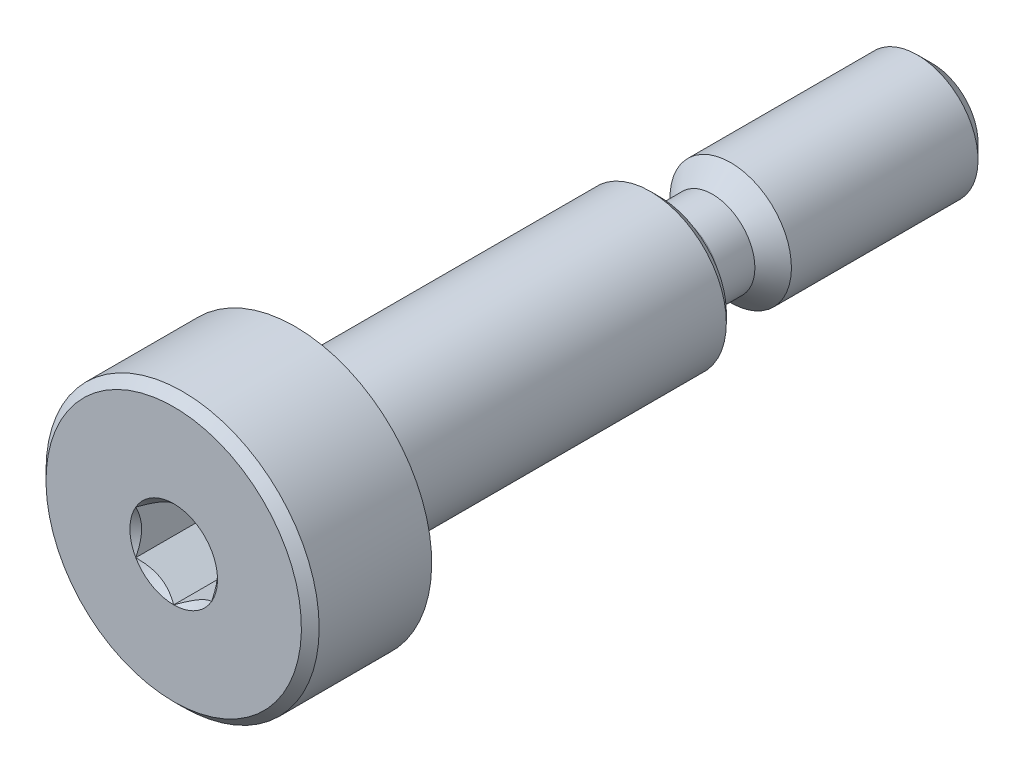
ISO-10303-21;
HEADER;
FILE_DESCRIPTION(('STEP AP214'),'2;1');
FILE_NAME('part.step','',(''),(''),'','','');
FILE_SCHEMA(('AUTOMOTIVE_DESIGN { 1 0 10303 214 1 1 1 1 }'));
ENDSEC;
DATA;
#1=APPLICATION_CONTEXT('core data for automotive mechanical design processes');
#2=APPLICATION_PROTOCOL_DEFINITION('international standard','automotive_design',2000,#1);
#3=PRODUCT_CONTEXT('',#1,'mechanical');
#4=PRODUCT('Part','Part','',(#3));
#5=PRODUCT_RELATED_PRODUCT_CATEGORY('part','',(#4));
#6=PRODUCT_DEFINITION_FORMATION('','',#4);
#7=PRODUCT_DEFINITION_CONTEXT('part definition',#1,'design');
#8=PRODUCT_DEFINITION('design','',#6,#7);
#9=PRODUCT_DEFINITION_SHAPE('','',#8);
#10=(LENGTH_UNIT() NAMED_UNIT(*) SI_UNIT(.MILLI.,.METRE.));
#11=(NAMED_UNIT(*) PLANE_ANGLE_UNIT() SI_UNIT($,.RADIAN.));
#12=(NAMED_UNIT(*) SI_UNIT($,.STERADIAN.) SOLID_ANGLE_UNIT());
#13=UNCERTAINTY_MEASURE_WITH_UNIT(LENGTH_MEASURE(1.E-05),#10,'distance_accuracy_value','');
#14=(GEOMETRIC_REPRESENTATION_CONTEXT(3) GLOBAL_UNCERTAINTY_ASSIGNED_CONTEXT((#13)) GLOBAL_UNIT_ASSIGNED_CONTEXT((#10,
#11,#12)) REPRESENTATION_CONTEXT('',''));
#15=CARTESIAN_POINT('',(0.,0.,0.));
#16=DIRECTION('',(0.,0.,1.));
#17=DIRECTION('',(1.,0.,0.));
#18=AXIS2_PLACEMENT_3D('',#15,#16,#17);
#19=CARTESIAN_POINT('',(0.,0.,-25.));
#20=DIRECTION('',(0.,0.,-1.));
#21=DIRECTION('',(0.,1.,0.));
#22=AXIS2_PLACEMENT_3D('',#19,#20,#21);
#23=CYLINDRICAL_SURFACE('',#22,2.5);
#24=CARTESIAN_POINT('',(0.,0.,-15.7075));
#25=DIRECTION('',(0.,0.,-1.));
#26=DIRECTION('',(0.,1.,0.));
#27=AXIS2_PLACEMENT_3D('',#24,#25,#26);
#28=CIRCLE('',#27,2.5);
#29=CARTESIAN_POINT('',(0.,-2.5,-15.7075));
#30=VERTEX_POINT('',#29);
#31=EDGE_CURVE('E256',#30,#30,#28,.F.);
#32=ORIENTED_EDGE('',*,*,#31,.T.);
#33=EDGE_LOOP('',(#32));
#34=FACE_BOUND('',#33,.T.);
#35=CARTESIAN_POINT('',(0.,0.,-4.7625));
#36=DIRECTION('',(0.,0.,-1.));
#37=DIRECTION('',(0.,1.,0.));
#38=AXIS2_PLACEMENT_3D('',#35,#36,#37);
#39=CIRCLE('',#38,2.5);
#40=CARTESIAN_POINT('',(0.,2.5,-4.7625));
#41=VERTEX_POINT('',#40);
#42=EDGE_CURVE('E284',#41,#41,#39,.T.);
#43=ORIENTED_EDGE('',*,*,#42,.T.);
#44=EDGE_LOOP('',(#43));
#45=FACE_BOUND('',#44,.T.);
#46=ADVANCED_FACE('F40',(#34,#45),#23,.T.);
#47=CARTESIAN_POINT('',(0.,-2.5,-16.));
#48=DIRECTION('',(0.,0.,-1.));
#49=DIRECTION('',(0.,1.,0.));
#50=AXIS2_PLACEMENT_3D('',#47,#48,#49);
#51=PLANE('',#50);
#52=CARTESIAN_POINT('',(0.,0.,-16.));
#53=DIRECTION('',(0.,0.,-1.));
#54=DIRECTION('',(0.,1.,0.));
#55=AXIS2_PLACEMENT_3D('',#52,#53,#54);
#56=CIRCLE('',#55,2.20749999999999);
#57=CARTESIAN_POINT('',(0.,-2.2075,-16.));
#58=VERTEX_POINT('',#57);
#59=EDGE_CURVE('E259',#58,#58,#56,.T.);
#60=ORIENTED_EDGE('',*,*,#59,.T.);
#61=EDGE_LOOP('',(#60));
#62=FACE_BOUND('',#61,.T.);
#63=CARTESIAN_POINT('',(0.,0.,-16.));
#64=DIRECTION('',(0.,0.,-1.));
#65=DIRECTION('',(0.,1.,0.));
#66=AXIS2_PLACEMENT_3D('',#63,#64,#65);
#67=CIRCLE('',#66,2.00000000000001);
#68=CARTESIAN_POINT('',(0.,2.00000000000001,-16.));
#69=VERTEX_POINT('',#68);
#70=EDGE_CURVE('E310',#69,#69,#67,.T.);
#71=ORIENTED_EDGE('',*,*,#70,.F.);
#72=EDGE_LOOP('',(#71));
#73=FACE_BOUND('',#72,.T.);
#74=ADVANCED_FACE('F210',(#62,#73),#51,.T.);
#75=CARTESIAN_POINT('',(0.,0.,-25.));
#76=DIRECTION('',(0.,0.,-1.));
#77=DIRECTION('',(0.,1.,0.));
#78=AXIS2_PLACEMENT_3D('',#75,#76,#77);
#79=CYLINDRICAL_SURFACE('',#78,1.9);
#80=CARTESIAN_POINT('',(0.,0.,-4.4375));
#81=DIRECTION('',(0.,0.,-1.));
#82=DIRECTION('',(0.,1.,0.));
#83=AXIS2_PLACEMENT_3D('',#80,#81,#82);
#84=CIRCLE('',#83,1.9);
#85=CARTESIAN_POINT('',(0.,1.9,-4.4375));
#86=VERTEX_POINT('',#85);
#87=EDGE_CURVE('E304',#86,#86,#84,.F.);
#88=ORIENTED_EDGE('',*,*,#87,.T.);
#89=EDGE_LOOP('',(#88));
#90=FACE_BOUND('',#89,.T.);
#91=CARTESIAN_POINT('',(0.,0.,-4.));
#92=DIRECTION('',(0.,0.,-1.));
#93=DIRECTION('',(0.,1.,0.));
#94=AXIS2_PLACEMENT_3D('',#91,#92,#93);
#95=CIRCLE('',#94,1.9);
#96=CARTESIAN_POINT('',(0.,1.9,-4.));
#97=VERTEX_POINT('',#96);
#98=EDGE_CURVE('E285',#97,#97,#95,.T.);
#99=ORIENTED_EDGE('',*,*,#98,.T.);
#100=EDGE_LOOP('',(#99));
#101=FACE_BOUND('',#100,.T.);
#102=ADVANCED_FACE('F216',(#90,#101),#79,.T.);
#103=CARTESIAN_POINT('',(0.,2.5,-4.6));
#104=DIRECTION('',(0.,0.,-1.));
#105=DIRECTION('',(0.,1.,0.));
#106=AXIS2_PLACEMENT_3D('',#103,#104,#105);
#107=PLANE('',#106);
#108=CARTESIAN_POINT('',(0.,0.,-4.6));
#109=DIRECTION('',(0.,0.,-1.));
#110=DIRECTION('',(0.,1.,0.));
#111=AXIS2_PLACEMENT_3D('',#108,#109,#110);
#112=CIRCLE('',#111,2.33749999999999);
#113=CARTESIAN_POINT('',(0.,2.33749999999999,-4.6));
#114=VERTEX_POINT('',#113);
#115=EDGE_CURVE('E300',#114,#114,#112,.F.);
#116=ORIENTED_EDGE('',*,*,#115,.T.);
#117=EDGE_LOOP('',(#116));
#118=FACE_BOUND('',#117,.T.);
#119=CARTESIAN_POINT('',(0.,0.,-4.6));
#120=DIRECTION('',(0.,0.,-1.));
#121=DIRECTION('',(0.,1.,0.));
#122=AXIS2_PLACEMENT_3D('',#119,#120,#121);
#123=CIRCLE('',#122,2.06249999999999);
#124=CARTESIAN_POINT('',(0.,2.06249999999999,-4.6));
#125=VERTEX_POINT('',#124);
#126=EDGE_CURVE('E290',#125,#125,#123,.T.);
#127=ORIENTED_EDGE('',*,*,#126,.T.);
#128=EDGE_LOOP('',(#127));
#129=FACE_BOUND('',#128,.T.);
#130=ADVANCED_FACE('F234',(#118,#129),#107,.F.);
#131=CARTESIAN_POINT('',(0.,0.,0.));
#132=DIRECTION('',(0.,0.,1.));
#133=DIRECTION('',(0.,-1.,0.));
#134=AXIS2_PLACEMENT_3D('',#131,#132,#133);
#135=PLANE('',#134);
#136=CARTESIAN_POINT('',(0.,0.,0.));
#137=DIRECTION('',(0.,0.,1.));
#138=DIRECTION('',(1.,0.,0.));
#139=AXIS2_PLACEMENT_3D('',#136,#137,#138);
#140=CIRCLE('',#139,1.44337567297406);
#141=CARTESIAN_POINT('',(0.,-1.44337567297406,0.));
#142=VERTEX_POINT('',#141);
#143=CARTESIAN_POINT('',(1.25,-0.721687836487032,0.));
#144=VERTEX_POINT('',#143);
#145=EDGE_CURVE('E61',#142,#144,#140,.T.);
#146=ORIENTED_EDGE('',*,*,#145,.F.);
#147=CARTESIAN_POINT('',(-1.25,-0.721687836487031,0.));
#148=VERTEX_POINT('',#147);
#149=EDGE_CURVE('E68',#148,#142,#140,.T.);
#150=ORIENTED_EDGE('',*,*,#149,.F.);
#151=CARTESIAN_POINT('',(-1.25,0.721687836487033,0.));
#152=VERTEX_POINT('',#151);
#153=EDGE_CURVE('E148',#152,#148,#140,.T.);
#154=ORIENTED_EDGE('',*,*,#153,.F.);
#155=CARTESIAN_POINT('',(0.,1.44337567297406,0.));
#156=VERTEX_POINT('',#155);
#157=EDGE_CURVE('E140',#156,#152,#140,.T.);
#158=ORIENTED_EDGE('',*,*,#157,.F.);
#159=CARTESIAN_POINT('',(1.25,0.721687836487033,0.));
#160=VERTEX_POINT('',#159);
#161=EDGE_CURVE('E110',#160,#156,#140,.T.);
#162=ORIENTED_EDGE('',*,*,#161,.F.);
#163=EDGE_CURVE('E100',#144,#160,#140,.T.);
#164=ORIENTED_EDGE('',*,*,#163,.F.);
#165=EDGE_LOOP('',(#146,#150,#154,#158,#162,#164));
#166=FACE_BOUND('',#165,.T.);
#167=CARTESIAN_POINT('',(0.,0.,0.));
#168=DIRECTION('',(0.,0.,1.));
#169=DIRECTION('',(0.,-1.,0.));
#170=AXIS2_PLACEMENT_3D('',#167,#168,#169);
#171=CIRCLE('',#170,4.2075);
#172=CARTESIAN_POINT('',(0.,-4.2075,0.));
#173=VERTEX_POINT('',#172);
#174=EDGE_CURVE('E55',#173,#173,#171,.T.);
#175=ORIENTED_EDGE('',*,*,#174,.T.);
#176=EDGE_LOOP('',(#175));
#177=FACE_BOUND('',#176,.T.);
#178=ADVANCED_FACE('F137',(#166,#177),#135,.T.);
#179=CARTESIAN_POINT('',(0.,0.,-25.));
#180=DIRECTION('',(0.,0.,-1.));
#181=DIRECTION('',(0.,1.,0.));
#182=AXIS2_PLACEMENT_3D('',#179,#180,#181);
#183=CYLINDRICAL_SURFACE('',#182,4.49999999999999);
#184=CARTESIAN_POINT('',(0.,0.,-0.292499999999994));
#185=DIRECTION('',(0.,0.,1.));
#186=DIRECTION('',(0.,-1.,0.));
#187=AXIS2_PLACEMENT_3D('',#184,#185,#186);
#188=CIRCLE('',#187,4.49999999999999);
#189=CARTESIAN_POINT('',(0.,-4.49999999999999,-0.292499999999993));
#190=VERTEX_POINT('',#189);
#191=EDGE_CURVE('E265',#190,#190,#188,.F.);
#192=ORIENTED_EDGE('',*,*,#191,.T.);
#193=EDGE_LOOP('',(#192));
#194=FACE_BOUND('',#193,.T.);
#195=CARTESIAN_POINT('',(0.,0.,-4.));
#196=DIRECTION('',(0.,0.,-1.));
#197=DIRECTION('',(0.,1.,0.));
#198=AXIS2_PLACEMENT_3D('',#195,#196,#197);
#199=CIRCLE('',#198,4.49999999999999);
#200=CARTESIAN_POINT('',(0.,4.49999999999999,-4.));
#201=VERTEX_POINT('',#200);
#202=EDGE_CURVE('E282',#201,#201,#199,.T.);
#203=ORIENTED_EDGE('',*,*,#202,.F.);
#204=EDGE_LOOP('',(#203));
#205=FACE_BOUND('',#204,.T.);
#206=ADVANCED_FACE('F227',(#194,#205),#183,.T.);
#207=CARTESIAN_POINT('',(0.,-4.49999999999999,-4.));
#208=DIRECTION('',(0.,0.,-1.));
#209=DIRECTION('',(0.,1.,0.));
#210=AXIS2_PLACEMENT_3D('',#207,#208,#209);
#211=PLANE('',#210);
#212=ORIENTED_EDGE('',*,*,#202,.T.);
#213=EDGE_LOOP('',(#212));
#214=FACE_BOUND('',#213,.T.);
#215=ORIENTED_EDGE('',*,*,#98,.F.);
#216=EDGE_LOOP('',(#215));
#217=FACE_BOUND('',#216,.T.);
#218=ADVANCED_FACE('F223',(#214,#217),#211,.T.);
#219=CARTESIAN_POINT('',(0.,0.,-4.7625));
#220=DIRECTION('',(0.,0.,-1.));
#221=DIRECTION('',(0.,1.,0.));
#222=AXIS2_PLACEMENT_3D('',#219,#220,#221);
#223=CONICAL_SURFACE('',#222,2.5,0.785398163397452);
#224=ORIENTED_EDGE('',*,*,#115,.F.);
#225=EDGE_LOOP('',(#224));
#226=FACE_BOUND('',#225,.T.);
#227=ORIENTED_EDGE('',*,*,#42,.F.);
#228=EDGE_LOOP('',(#227));
#229=FACE_BOUND('',#228,.T.);
#230=ADVANCED_FACE('F226',(#226,#229),#223,.T.);
#231=CARTESIAN_POINT('',(0.,0.,-4.6));
#232=DIRECTION('',(0.,0.,-1.));
#233=DIRECTION('',(0.,1.,0.));
#234=AXIS2_PLACEMENT_3D('',#231,#232,#233);
#235=CONICAL_SURFACE('',#234,2.06249999999999,0.785398163397456);
#236=ORIENTED_EDGE('',*,*,#87,.F.);
#237=EDGE_LOOP('',(#236));
#238=FACE_BOUND('',#237,.T.);
#239=ORIENTED_EDGE('',*,*,#126,.F.);
#240=EDGE_LOOP('',(#239));
#241=FACE_BOUND('',#240,.T.);
#242=ADVANCED_FACE('F237',(#238,#241),#235,.T.);
#243=CARTESIAN_POINT('',(0.,0.,-16.602));
#244=DIRECTION('',(0.,0.,-1.));
#245=DIRECTION('',(0.,1.,0.));
#246=AXIS2_PLACEMENT_3D('',#243,#244,#245);
#247=TOROIDAL_SURFACE('',#246,2.00000000000001,0.602000000000016);
#248=CARTESIAN_POINT('',(0.,0.,-16.602));
#249=DIRECTION('',(0.,0.,-1.));
#250=DIRECTION('',(0.,1.,0.));
#251=AXIS2_PLACEMENT_3D('',#248,#249,#250);
#252=CIRCLE('',#251,1.398);
#253=CARTESIAN_POINT('',(0.,1.39799999999999,-16.602));
#254=VERTEX_POINT('',#253);
#255=EDGE_CURVE('E388',#254,#254,#252,.T.);
#256=ORIENTED_EDGE('',*,*,#255,.F.);
#257=EDGE_LOOP('',(#256));
#258=FACE_BOUND('',#257,.T.);
#259=ORIENTED_EDGE('',*,*,#70,.T.);
#260=EDGE_LOOP('',(#259));
#261=FACE_BOUND('',#260,.T.);
#262=ADVANCED_FACE('F241',(#258,#261),#247,.F.);
#263=CARTESIAN_POINT('',(0.,0.,-25.));
#264=DIRECTION('',(0.,0.,-1.));
#265=DIRECTION('',(0.,1.,0.));
#266=AXIS2_PLACEMENT_3D('',#263,#264,#265);
#267=CYLINDRICAL_SURFACE('',#266,1.398);
#268=CARTESIAN_POINT('',(0.,0.,-17.75));
#269=DIRECTION('',(0.,0.,-1.));
#270=DIRECTION('',(0.,1.,0.));
#271=AXIS2_PLACEMENT_3D('',#268,#269,#270);
#272=CIRCLE('',#271,1.398);
#273=CARTESIAN_POINT('',(0.,1.39799999999999,-17.75));
#274=VERTEX_POINT('',#273);
#275=EDGE_CURVE('E372',#274,#274,#272,.T.);
#276=ORIENTED_EDGE('',*,*,#275,.F.);
#277=EDGE_LOOP('',(#276));
#278=FACE_BOUND('',#277,.T.);
#279=ORIENTED_EDGE('',*,*,#255,.T.);
#280=EDGE_LOOP('',(#279));
#281=FACE_BOUND('',#280,.T.);
#282=ADVANCED_FACE('F325',(#278,#281),#267,.T.);
#283=CARTESIAN_POINT('',(0.,0.,-17.75));
#284=DIRECTION('',(0.,0.,-1.));
#285=DIRECTION('',(0.,1.,0.));
#286=AXIS2_PLACEMENT_3D('',#283,#284,#285);
#287=CONICAL_SURFACE('',#286,1.398,0.785398163397446);
#288=CARTESIAN_POINT('',(0.,0.,-18.352));
#289=DIRECTION('',(0.,0.,-1.));
#290=DIRECTION('',(0.,1.,0.));
#291=AXIS2_PLACEMENT_3D('',#288,#289,#290);
#292=CIRCLE('',#291,2.00000000000001);
#293=CARTESIAN_POINT('',(0.,2.00000000000001,-18.352));
#294=VERTEX_POINT('',#293);
#295=EDGE_CURVE('E293',#294,#294,#292,.F.);
#296=ORIENTED_EDGE('',*,*,#295,.T.);
#297=EDGE_LOOP('',(#296));
#298=FACE_BOUND('',#297,.T.);
#299=ORIENTED_EDGE('',*,*,#275,.T.);
#300=EDGE_LOOP('',(#299));
#301=FACE_BOUND('',#300,.T.);
#302=ADVANCED_FACE('F318',(#298,#301),#287,.T.);
#303=CARTESIAN_POINT('',(0.,-2.00000000000002,-25.));
#304=DIRECTION('',(0.,0.,-1.));
#305=DIRECTION('',(0.,1.,0.));
#306=AXIS2_PLACEMENT_3D('',#303,#304,#305);
#307=PLANE('',#306);
#308=CARTESIAN_POINT('',(0.,0.,-25.));
#309=DIRECTION('',(0.,0.,-1.));
#310=DIRECTION('',(0.,1.,0.));
#311=AXIS2_PLACEMENT_3D('',#308,#309,#310);
#312=CIRCLE('',#311,1.50000000000002);
#313=CARTESIAN_POINT('',(0.,1.50000000000001,-25.));
#314=VERTEX_POINT('',#313);
#315=EDGE_CURVE('E268',#314,#314,#312,.T.);
#316=ORIENTED_EDGE('',*,*,#315,.T.);
#317=EDGE_LOOP('',(#316));
#318=FACE_BOUND('',#317,.T.);
#319=ADVANCED_FACE('F315',(#318),#307,.T.);
#320=CARTESIAN_POINT('',(0.,0.,-25.));
#321=DIRECTION('',(0.,0.,-1.));
#322=DIRECTION('',(0.,1.,0.));
#323=AXIS2_PLACEMENT_3D('',#320,#321,#322);
#324=CYLINDRICAL_SURFACE('',#323,2.00000000000001);
#325=CARTESIAN_POINT('',(0.,0.,-24.5));
#326=DIRECTION('',(0.,0.,-1.));
#327=DIRECTION('',(0.,1.,0.));
#328=AXIS2_PLACEMENT_3D('',#325,#326,#327);
#329=CIRCLE('',#328,2.00000000000001);
#330=CARTESIAN_POINT('',(0.,2.00000000000001,-24.5));
#331=VERTEX_POINT('',#330);
#332=EDGE_CURVE('E261',#331,#331,#329,.F.);
#333=ORIENTED_EDGE('',*,*,#332,.T.);
#334=EDGE_LOOP('',(#333));
#335=FACE_BOUND('',#334,.T.);
#336=ORIENTED_EDGE('',*,*,#295,.F.);
#337=EDGE_LOOP('',(#336));
#338=FACE_BOUND('',#337,.T.);
#339=ADVANCED_FACE('F246',(#335,#338),#324,.T.);
#340=CARTESIAN_POINT('',(0.,0.,-25.));
#341=DIRECTION('',(0.,0.,1.));
#342=DIRECTION('',(0.,-1.,0.));
#343=AXIS2_PLACEMENT_3D('',#340,#341,#342);
#344=CONICAL_SURFACE('',#343,1.50000000000002,0.785398163397447);
#345=ORIENTED_EDGE('',*,*,#332,.F.);
#346=EDGE_LOOP('',(#345));
#347=FACE_BOUND('',#346,.T.);
#348=ORIENTED_EDGE('',*,*,#315,.F.);
#349=EDGE_LOOP('',(#348));
#350=FACE_BOUND('',#349,.T.);
#351=ADVANCED_FACE('F243',(#347,#350),#344,.T.);
#352=CARTESIAN_POINT('',(0.,0.,-16.));
#353=DIRECTION('',(0.,0.,1.));
#354=DIRECTION('',(0.,-1.,0.));
#355=AXIS2_PLACEMENT_3D('',#352,#353,#354);
#356=CONICAL_SURFACE('',#355,2.20749999999999,0.785398163397445);
#357=CARTESIAN_POINT('',(0.,-2.5,-15.7075));
#358=CARTESIAN_POINT('',(0.,-2.496953125,-15.710546875));
#359=CARTESIAN_POINT('',(0.,-2.49390625,-15.71359375));
#360=CARTESIAN_POINT('',(0.,-2.4878125,-15.7196875));
#361=CARTESIAN_POINT('',(0.,-2.484765625,-15.722734375));
#362=CARTESIAN_POINT('',(0.,-2.478671875,-15.728828125));
#363=CARTESIAN_POINT('',(0.,-2.475625,-15.731875));
#364=CARTESIAN_POINT('',(0.,-2.46953125,-15.73796875));
#365=CARTESIAN_POINT('',(0.,-2.466484375,-15.741015625));
#366=CARTESIAN_POINT('',(0.,-2.460390625,-15.747109375));
#367=CARTESIAN_POINT('',(0.,-2.45734375,-15.75015625));
#368=CARTESIAN_POINT('',(0.,-2.45125,-15.75625));
#369=CARTESIAN_POINT('',(0.,-2.448203125,-15.759296875));
#370=CARTESIAN_POINT('',(0.,-2.442109375,-15.765390625));
#371=CARTESIAN_POINT('',(0.,-2.4390625,-15.7684375));
#372=CARTESIAN_POINT('',(0.,-2.43296875,-15.77453125));
#373=CARTESIAN_POINT('',(0.,-2.429921875,-15.777578125));
#374=CARTESIAN_POINT('',(0.,-2.423828125,-15.783671875));
#375=CARTESIAN_POINT('',(0.,-2.42078125,-15.78671875));
#376=CARTESIAN_POINT('',(0.,-2.4146875,-15.7928125));
#377=CARTESIAN_POINT('',(0.,-2.411640625,-15.795859375));
#378=CARTESIAN_POINT('',(0.,-2.405546875,-15.801953125));
#379=CARTESIAN_POINT('',(0.,-2.4025,-15.805));
#380=CARTESIAN_POINT('',(0.,-2.39640625,-15.81109375));
#381=CARTESIAN_POINT('',(0.,-2.393359375,-15.814140625));
#382=CARTESIAN_POINT('',(0.,-2.387265625,-15.820234375));
#383=CARTESIAN_POINT('',(0.,-2.38421875,-15.82328125));
#384=CARTESIAN_POINT('',(0.,-2.378125,-15.829375));
#385=CARTESIAN_POINT('',(0.,-2.375078125,-15.832421875));
#386=CARTESIAN_POINT('',(0.,-2.368984375,-15.838515625));
#387=CARTESIAN_POINT('',(0.,-2.3659375,-15.8415625));
#388=CARTESIAN_POINT('',(0.,-2.35984375,-15.84765625));
#389=CARTESIAN_POINT('',(0.,-2.356796875,-15.850703125));
#390=CARTESIAN_POINT('',(0.,-2.350703125,-15.856796875));
#391=CARTESIAN_POINT('',(0.,-2.34765625,-15.85984375));
#392=CARTESIAN_POINT('',(0.,-2.3415625,-15.8659375));
#393=CARTESIAN_POINT('',(0.,-2.338515625,-15.868984375));
#394=CARTESIAN_POINT('',(0.,-2.332421875,-15.875078125));
#395=CARTESIAN_POINT('',(0.,-2.329375,-15.878125));
#396=CARTESIAN_POINT('',(0.,-2.32328125,-15.88421875));
#397=CARTESIAN_POINT('',(0.,-2.320234375,-15.887265625));
#398=CARTESIAN_POINT('',(0.,-2.314140625,-15.893359375));
#399=CARTESIAN_POINT('',(0.,-2.31109375,-15.89640625));
#400=CARTESIAN_POINT('',(0.,-2.305,-15.9025));
#401=CARTESIAN_POINT('',(0.,-2.301953125,-15.905546875));
#402=CARTESIAN_POINT('',(0.,-2.295859375,-15.911640625));
#403=CARTESIAN_POINT('',(0.,-2.2928125,-15.9146875));
#404=CARTESIAN_POINT('',(0.,-2.28671875,-15.92078125));
#405=CARTESIAN_POINT('',(0.,-2.283671875,-15.923828125));
#406=CARTESIAN_POINT('',(0.,-2.277578125,-15.929921875));
#407=CARTESIAN_POINT('',(0.,-2.27453125,-15.93296875));
#408=CARTESIAN_POINT('',(0.,-2.2684375,-15.9390625));
#409=CARTESIAN_POINT('',(0.,-2.265390625,-15.942109375));
#410=CARTESIAN_POINT('',(0.,-2.259296875,-15.948203125));
#411=CARTESIAN_POINT('',(0.,-2.25625,-15.95125));
#412=CARTESIAN_POINT('',(0.,-2.25015625,-15.95734375));
#413=CARTESIAN_POINT('',(0.,-2.247109375,-15.960390625));
#414=CARTESIAN_POINT('',(0.,-2.241015625,-15.966484375));
#415=CARTESIAN_POINT('',(0.,-2.23796875,-15.96953125));
#416=CARTESIAN_POINT('',(0.,-2.231875,-15.975625));
#417=CARTESIAN_POINT('',(0.,-2.228828125,-15.978671875));
#418=CARTESIAN_POINT('',(0.,-2.222734375,-15.984765625));
#419=CARTESIAN_POINT('',(0.,-2.2196875,-15.9878125));
#420=CARTESIAN_POINT('',(0.,-2.21359375,-15.99390625));
#421=CARTESIAN_POINT('',(0.,-2.210546875,-15.996953125));
#422=CARTESIAN_POINT('',(0.,-2.2075,-16.));
#423=B_SPLINE_CURVE_WITH_KNOTS('',3,(#357,#358,#359,#360,#361,#362,#363,#364,#365,#366,#367,
#368,#369,#370,#371,#372,#373,#374,#375,#376,#377,#378,#379,#380,#381,#382,#383,#384,#385,#386,
#387,#388,#389,#390,#391,#392,#393,#394,#395,#396,#397,#398,#399,#400,#401,#402,#403,#404,#405,
#406,#407,#408,#409,#410,#411,#412,#413,#414,#415,#416,#417,#418,#419,#420,#421,#422),
.UNSPECIFIED.,.F.,.F.,(4,2,2,2,2,2,2,2,2,2,2,2,2,2,2,2,2,2,2,2,2,2,2,2,2,2,2,2,2,2,2,2,4),(0.,
0.0129267958435648,0.025853591687132,0.0387803875306992,0.0517071833742665,0.0646339792178312,
0.0775607750613985,0.090487570904966,0.103414366748533,0.1163411625921,0.129267958435665,
0.142194754279233,0.1551215501228,0.168048345966367,0.180975141809932,0.193901937653499,
0.206828733497067,0.219755529340634,0.232682325184201,0.245609121027766,0.258535916871333,
0.2714627127149,0.284389508558467,0.297316304402032,0.310243100245599,0.323169896089167,
0.336096691932734,0.349023487776301,0.361950283619866,0.374877079463433,0.387803875307001,
0.400730671150568,0.413657466994135),.UNSPECIFIED.);
#424=EDGE_CURVE('BSEAM245',#30,#58,#423,.T.);
#425=ORIENTED_EDGE('',*,*,#31,.F.);
#426=ORIENTED_EDGE('',*,*,#59,.F.);
#427=ORIENTED_EDGE('',*,*,#424,.T.);
#428=ORIENTED_EDGE('',*,*,#424,.F.);
#429=EDGE_LOOP('',(#425,#427,#426,#428));
#430=FACE_BOUND('',#429,.T.);
#431=ADVANCED_FACE('F245',(#430),#356,.T.);
#432=CARTESIAN_POINT('',(0.,0.,-0.292499999999994));
#433=DIRECTION('',(0.,0.,-1.));
#434=DIRECTION('',(0.,1.,0.));
#435=AXIS2_PLACEMENT_3D('',#432,#433,#434);
#436=CONICAL_SURFACE('',#435,4.49999999999999,0.78539816339745);
#437=ORIENTED_EDGE('',*,*,#174,.F.);
#438=EDGE_LOOP('',(#437));
#439=FACE_BOUND('',#438,.T.);
#440=ORIENTED_EDGE('',*,*,#191,.F.);
#441=EDGE_LOOP('',(#440));
#442=FACE_BOUND('',#441,.T.);
#443=ADVANCED_FACE('F42',(#439,#442),#436,.T.);
#444=CARTESIAN_POINT('',(0.,0.,0.));
#445=DIRECTION('',(0.,0.,1.));
#446=DIRECTION('',(1.,0.,0.));
#447=AXIS2_PLACEMENT_3D('',#444,#445,#446);
#448=CONICAL_SURFACE('',#447,1.44337567297406,0.78539816339745);
#449=ORIENTED_EDGE('',*,*,#161,.T.);
#450=CARTESIAN_POINT('',(1.2502,0.721572366433195,0.000115483909136022));
#451=CARTESIAN_POINT('',(1.20722483292841,0.746384090710445,-0.0246783319448963));
#452=CARTESIAN_POINT('',(1.16353099525405,0.771610739653665,-0.0480162655813163));
#453=CARTESIAN_POINT('',(1.07443406915806,0.823050873919155,-0.0907479959154632));
#454=CARTESIAN_POINT('',(1.02902250164294,0.849269254648334,-0.110118007639586));
#455=CARTESIAN_POINT('',(0.93745217906474,0.902137405038636,-0.143299516586523));
#456=CARTESIAN_POINT('',(0.891316759824115,0.928773701756387,-0.157194440947344));
#457=CARTESIAN_POINT('',(0.798029919592408,0.982632884076013,-0.178602717839361));
#458=CARTESIAN_POINT('',(0.750881350863621,1.00985412292348,-0.186132058433213));
#459=CARTESIAN_POINT('',(0.669626443112748,1.05676666578643,-0.192925501949297));
#460=CARTESIAN_POINT('',(0.635625123372059,1.07639733689152,-0.19393144089565));
#461=CARTESIAN_POINT('',(0.567682235567523,1.11562418145499,-0.192238585088681));
#462=CARTESIAN_POINT('',(0.533740682344343,1.1352203463451,-0.189538972784462));
#463=CARTESIAN_POINT('',(0.466185143542501,1.1742235548576,-0.180591069683623));
#464=CARTESIAN_POINT('',(0.432571492713226,1.19363040521233,-0.174339474100294));
#465=CARTESIAN_POINT('',(0.365905361782187,1.23212011385119,-0.158624318586096));
#466=CARTESIAN_POINT('',(0.332853128969705,1.2512028293628,-0.149159379912542));
#467=CARTESIAN_POINT('',(0.248200308399736,1.30007715810653,-0.121068609312414));
#468=CARTESIAN_POINT('',(0.197133507570362,1.32956058931202,-0.1003298425478));
#469=CARTESIAN_POINT('',(0.0969991458867453,1.38737318998519,-0.0536128653285237));
#470=CARTESIAN_POINT('',(0.0479256884217307,1.41570576386268,-0.0276517040532339));
#471=CARTESIAN_POINT('',(-0.000199999999999889,1.4434911430279,0.00011548390913592));
#472=B_SPLINE_CURVE_WITH_KNOTS('',3,(#450,#451,#452,#453,#454,#455,#456,#457,#458,#459,#460,
#461,#462,#463,#464,#465,#466,#467,#468,#469,#470,#471),.UNSPECIFIED.,.F.,.F.,(4,2,2,2,2,2,2,2,
2,2,4),(0.,0.166533409618304,0.334037607289761,0.498880396489698,0.663307919240274,
0.780963963458826,0.898645970148452,1.01643764860773,1.13427993171549,1.32148652032141,
1.50809158792573),.UNSPECIFIED.);
#473=EDGE_CURVE('E11',#160,#156,#472,.T.);
#474=ORIENTED_EDGE('',*,*,#473,.F.);
#475=EDGE_LOOP('',(#449,#474));
#476=FACE_BOUND('',#475,.T.);
#477=ADVANCED_FACE('F113',(#476),#448,.F.);
#478=ORIENTED_EDGE('',*,*,#157,.T.);
#479=CARTESIAN_POINT('',(0.000200000000000186,1.4434911430279,0.000115483909136109));
#480=CARTESIAN_POINT('',(-0.0427751670715865,1.41867941875065,-0.0246783319448963));
#481=CARTESIAN_POINT('',(-0.0864690047459478,1.39345276980743,-0.0480162655813164));
#482=CARTESIAN_POINT('',(-0.175565930841942,1.34201263554194,-0.0907479959154633));
#483=CARTESIAN_POINT('',(-0.220977498357064,1.31579425481276,-0.110118007639586));
#484=CARTESIAN_POINT('',(-0.312547820935259,1.26292610442246,-0.143299516586523));
#485=CARTESIAN_POINT('',(-0.358683240175885,1.23628980770471,-0.157194440947344));
#486=CARTESIAN_POINT('',(-0.451970080407592,1.18243062538508,-0.178602717839361));
#487=CARTESIAN_POINT('',(-0.499118649136379,1.15520938653761,-0.186132058433213));
#488=CARTESIAN_POINT('',(-0.580373556887252,1.10829684367467,-0.192925501949297));
#489=CARTESIAN_POINT('',(-0.614374876627941,1.08866617256958,-0.19393144089565));
#490=CARTESIAN_POINT('',(-0.682317764432477,1.04943932800611,-0.192238585088681));
#491=CARTESIAN_POINT('',(-0.716259317655657,1.02984316311599,-0.189538972784462));
#492=CARTESIAN_POINT('',(-0.783814856457499,0.9908399546035,-0.180591069683623));
#493=CARTESIAN_POINT('',(-0.817428507286775,0.971433104248771,-0.174339474100294));
#494=CARTESIAN_POINT('',(-0.884094638217813,0.932943395609906,-0.158624318586096));
#495=CARTESIAN_POINT('',(-0.917146871030295,0.913860680098301,-0.149159379912542));
#496=CARTESIAN_POINT('',(-1.00179969160026,0.864986351354568,-0.121068609312414));
#497=CARTESIAN_POINT('',(-1.05286649242964,0.835502920149076,-0.1003298425478));
#498=CARTESIAN_POINT('',(-1.15300085411325,0.777690319475909,-0.0536128653285241));
#499=CARTESIAN_POINT('',(-1.20207431157827,0.749357745598417,-0.0276517040532343));
#500=CARTESIAN_POINT('',(-1.2502,0.721572366433195,0.000115483909135703));
#501=B_SPLINE_CURVE_WITH_KNOTS('',3,(#479,#480,#481,#482,#483,#484,#485,#486,#487,#488,#489,
#490,#491,#492,#493,#494,#495,#496,#497,#498,#499,#500),.UNSPECIFIED.,.F.,.F.,(4,2,2,2,2,2,2,2,
2,2,4),(0.,0.166533409618303,0.334037607289761,0.498880396489698,0.663307919240274,
0.780963963458826,0.898645970148453,1.01643764860773,1.13427993171549,1.32148652032141,
1.50809158792573),.UNSPECIFIED.);
#502=EDGE_CURVE('E142',#156,#152,#501,.T.);
#503=ORIENTED_EDGE('',*,*,#502,.F.);
#504=EDGE_LOOP('',(#478,#503));
#505=FACE_BOUND('',#504,.T.);
#506=ADVANCED_FACE('F416',(#505),#448,.F.);
#507=ORIENTED_EDGE('',*,*,#153,.T.);
#508=CARTESIAN_POINT('',(-1.25,-1.43934010808077,0.462982096892325));
#509=CARTESIAN_POINT('',(-1.25,-1.40429313005658,0.436524922632888));
#510=CARTESIAN_POINT('',(-1.25,-1.36905087135599,0.410327160354278));
#511=CARTESIAN_POINT('',(-1.25,-1.29809650706311,0.358557571839583));
#512=CARTESIAN_POINT('',(-1.25,-1.26238428576495,0.332985904356292));
#513=CARTESIAN_POINT('',(-1.25,-1.15390111792708,0.257005993689462));
#514=CARTESIAN_POINT('',(-1.25,-1.08031646726264,0.207740286189565));
#515=CARTESIAN_POINT('',(-1.25,-0.926012322755094,0.11102583026313));
#516=CARTESIAN_POINT('',(-1.25,-0.845125318656145,0.0638412989417952));
#517=CARTESIAN_POINT('',(-1.25,-0.679311174076601,-0.0224692656095877));
#518=CARTESIAN_POINT('',(-1.25,-0.594398891026687,-0.0616224653731007));
#519=CARTESIAN_POINT('',(-1.25,-0.46694481246074,-0.109522776311709));
#520=CARTESIAN_POINT('',(-1.25,-0.426289985812821,-0.123270510213665));
#521=CARTESIAN_POINT('',(-1.25,-0.343998850091267,-0.147502072549458));
#522=CARTESIAN_POINT('',(-1.25,-0.302362473614961,-0.157985676130229));
#523=CARTESIAN_POINT('',(-1.25,-0.219052696285665,-0.174969838251704));
#524=CARTESIAN_POINT('',(-1.25,-0.177393428474499,-0.181538639528632));
#525=CARTESIAN_POINT('',(-1.25,-0.0936293693401917,-0.190564946542242));
#526=CARTESIAN_POINT('',(-1.25,-0.0515246558543956,-0.193023159002733));
#527=CARTESIAN_POINT('',(-1.25,0.0311890576306319,-0.193645937986716));
#528=CARTESIAN_POINT('',(-1.25,0.0717969625499308,-0.191962883153754));
#529=CARTESIAN_POINT('',(-1.25,0.152668636885197,-0.184731729402087));
#530=CARTESIAN_POINT('',(-1.25,0.192932338835358,-0.179182889586893));
#531=CARTESIAN_POINT('',(-1.25,0.273499879165295,-0.164428963535047));
#532=CARTESIAN_POINT('',(-1.25,0.313792180618511,-0.155161824035895));
#533=CARTESIAN_POINT('',(-1.25,0.393496413911457,-0.133463821542654));
#534=CARTESIAN_POINT('',(-1.25,0.432908419115059,-0.121033223269356));
#535=CARTESIAN_POINT('',(-1.25,0.556992735862298,-0.0772206470685637));
#536=CARTESIAN_POINT('',(-1.25,0.639898924666085,-0.040848927124045));
#537=CARTESIAN_POINT('',(-1.25,0.801816555499701,0.0400191621783339));
#538=CARTESIAN_POINT('',(-1.25,0.880812666325044,0.0845447209119849));
#539=CARTESIAN_POINT('',(-1.25,1.0317856127975,0.176404876666624));
#540=CARTESIAN_POINT('',(-1.25,1.10391618485086,0.223489933916248));
#541=CARTESIAN_POINT('',(-1.25,1.2101860604331,0.296278561598537));
#542=CARTESIAN_POINT('',(-1.25,1.24515069969379,0.320798085393357));
#543=CARTESIAN_POINT('',(-1.25,1.31460220852736,0.370485636765679));
#544=CARTESIAN_POINT('',(-1.25,1.34908920596618,0.395653485415519));
#545=CARTESIAN_POINT('',(-1.25,1.38337731682912,0.421090148841212));
#546=B_SPLINE_CURVE_WITH_KNOTS('',3,(#508,#509,#510,#511,#512,#513,#514,#515,#516,#517,#518,
#519,#520,#521,#522,#523,#524,#525,#526,#527,#528,#529,#530,#531,#532,#533,#534,#535,#536,#537,
#538,#539,#540,#541,#542,#543,#544,#545),.UNSPECIFIED.,.F.,.F.,(4,2,2,2,2,2,2,2,2,2,2,2,2,2,2,2,
2,2,4),(0.,0.131732960381448,0.263498984161645,0.529042014455825,0.809741926134618,
1.08947609717225,1.21811634272576,1.346765447839,1.47310084517844,1.59941451973784,
1.72115042167849,1.84290966131735,1.96679153905341,2.09066305366039,2.36146692896009,
2.63325989198491,2.89154668212279,3.01965734507713,3.14773302245628),.UNSPECIFIED.);
#547=EDGE_CURVE('E146',#152,#148,#546,.F.);
#548=ORIENTED_EDGE('',*,*,#547,.F.);
#549=EDGE_LOOP('',(#507,#548));
#550=FACE_BOUND('',#549,.T.);
#551=ADVANCED_FACE('F411',(#550),#448,.F.);
#552=ORIENTED_EDGE('',*,*,#149,.T.);
#553=CARTESIAN_POINT('',(-1.2502,-0.721572366433194,0.000115483909135154));
#554=CARTESIAN_POINT('',(-1.20722483292841,-0.746384090710443,-0.0246783319448972));
#555=CARTESIAN_POINT('',(-1.16353099525405,-0.771610739653664,-0.0480162655813173));
#556=CARTESIAN_POINT('',(-1.07443406915806,-0.823050873919154,-0.0907479959154643));
#557=CARTESIAN_POINT('',(-1.02902250164294,-0.849269254648332,-0.110118007639587));
#558=CARTESIAN_POINT('',(-0.93745217906474,-0.902137405038635,-0.143299516586524));
#559=CARTESIAN_POINT('',(-0.891316759824114,-0.928773701756386,-0.157194440947345));
#560=CARTESIAN_POINT('',(-0.798029919592407,-0.982632884076012,-0.178602717839362));
#561=CARTESIAN_POINT('',(-0.75088135086362,-1.00985412292348,-0.186132058433214));
#562=CARTESIAN_POINT('',(-0.669626443112748,-1.05676666578643,-0.192925501949298));
#563=CARTESIAN_POINT('',(-0.635625123372059,-1.07639733689152,-0.193931440895651));
#564=CARTESIAN_POINT('',(-0.567682235567523,-1.11562418145499,-0.192238585088682));
#565=CARTESIAN_POINT('',(-0.533740682344343,-1.1352203463451,-0.189538972784463));
#566=CARTESIAN_POINT('',(-0.466185143542501,-1.1742235548576,-0.180591069683624));
#567=CARTESIAN_POINT('',(-0.432571492713226,-1.19363040521232,-0.174339474100295));
#568=CARTESIAN_POINT('',(-0.365905361782187,-1.23212011385119,-0.158624318586097));
#569=CARTESIAN_POINT('',(-0.332853128969705,-1.2512028293628,-0.149159379912543));
#570=CARTESIAN_POINT('',(-0.248200308399736,-1.30007715810653,-0.121068609312415));
#571=CARTESIAN_POINT('',(-0.197133507570362,-1.32956058931202,-0.100329842547801));
#572=CARTESIAN_POINT('',(-0.0969991458867454,-1.38737318998519,-0.053612865328525));
#573=CARTESIAN_POINT('',(-0.0479256884217309,-1.41570576386268,-0.0276517040532353));
#574=CARTESIAN_POINT('',(0.000199999999999721,-1.4434911430279,0.000115483909134809));
#575=B_SPLINE_CURVE_WITH_KNOTS('',3,(#553,#554,#555,#556,#557,#558,#559,#560,#561,#562,#563,
#564,#565,#566,#567,#568,#569,#570,#571,#572,#573,#574),.UNSPECIFIED.,.F.,.F.,(4,2,2,2,2,2,2,2,
2,2,4),(0.,0.166533409618304,0.334037607289762,0.498880396489698,0.663307919240274,
0.780963963458826,0.898645970148452,1.01643764860773,1.13427993171549,1.32148652032141,
1.50809158792573),.UNSPECIFIED.);
#576=EDGE_CURVE('E174',#148,#142,#575,.T.);
#577=ORIENTED_EDGE('',*,*,#576,.F.);
#578=EDGE_LOOP('',(#552,#577));
#579=FACE_BOUND('',#578,.T.);
#580=ADVANCED_FACE('F415',(#579),#448,.F.);
#581=ORIENTED_EDGE('',*,*,#145,.T.);
#582=CARTESIAN_POINT('',(-0.000200000000000239,-1.4434911430279,0.000115483909134808));
#583=CARTESIAN_POINT('',(0.0427751670715864,-1.41867941875065,-0.0246783319448975));
#584=CARTESIAN_POINT('',(0.0864690047459476,-1.39345276980743,-0.0480162655813176));
#585=CARTESIAN_POINT('',(0.175565930841941,-1.34201263554194,-0.0907479959154644));
#586=CARTESIAN_POINT('',(0.220977498357063,-1.31579425481276,-0.110118007639587));
#587=CARTESIAN_POINT('',(0.312547820935259,-1.26292610442246,-0.143299516586524));
#588=CARTESIAN_POINT('',(0.358683240175885,-1.23628980770471,-0.157194440947345));
#589=CARTESIAN_POINT('',(0.451970080407591,-1.18243062538508,-0.178602717839362));
#590=CARTESIAN_POINT('',(0.499118649136378,-1.15520938653761,-0.186132058433214));
#591=CARTESIAN_POINT('',(0.580373556887251,-1.10829684367467,-0.192925501949298));
#592=CARTESIAN_POINT('',(0.614374876627939,-1.08866617256958,-0.193931440895651));
#593=CARTESIAN_POINT('',(0.682317764432476,-1.04943932800611,-0.192238585088682));
#594=CARTESIAN_POINT('',(0.716259317655656,-1.02984316311599,-0.189538972784463));
#595=CARTESIAN_POINT('',(0.783814856457498,-0.990839954603499,-0.180591069683624));
#596=CARTESIAN_POINT('',(0.817428507286773,-0.971433104248771,-0.174339474100295));
#597=CARTESIAN_POINT('',(0.884094638217811,-0.932943395609906,-0.158624318586097));
#598=CARTESIAN_POINT('',(0.917146871030294,-0.913860680098301,-0.149159379912543));
#599=CARTESIAN_POINT('',(1.00179969160026,-0.864986351354568,-0.121068609312415));
#600=CARTESIAN_POINT('',(1.05286649242964,-0.835502920149076,-0.100329842547801));
#601=CARTESIAN_POINT('',(1.15300085411325,-0.777690319475908,-0.0536128653285245));
#602=CARTESIAN_POINT('',(1.20207431157827,-0.749357745598416,-0.0276517040532346));
#603=CARTESIAN_POINT('',(1.2502,-0.721572366433194,0.000115483909135676));
#604=B_SPLINE_CURVE_WITH_KNOTS('',3,(#582,#583,#584,#585,#586,#587,#588,#589,#590,#591,#592,
#593,#594,#595,#596,#597,#598,#599,#600,#601,#602,#603),.UNSPECIFIED.,.F.,.F.,(4,2,2,2,2,2,2,2,
2,2,4),(0.,0.166533409618303,0.334037607289761,0.498880396489697,0.663307919240272,
0.780963963458825,0.898645970148451,1.01643764860773,1.13427993171549,1.32148652032141,
1.50809158792574),.UNSPECIFIED.);
#605=EDGE_CURVE('E126',#142,#144,#604,.T.);
#606=ORIENTED_EDGE('',*,*,#605,.F.);
#607=EDGE_LOOP('',(#581,#606));
#608=FACE_BOUND('',#607,.T.);
#609=ADVANCED_FACE('F167',(#608),#448,.F.);
#610=ORIENTED_EDGE('',*,*,#163,.T.);
#611=CARTESIAN_POINT('',(1.25,-1.43934010829019,0.462982097050439));
#612=CARTESIAN_POINT('',(1.25,-1.40429313026013,0.436524922784912));
#613=CARTESIAN_POINT('',(1.25,-1.36905087155364,0.410327160500222));
#614=CARTESIAN_POINT('',(1.25,-1.29809650724891,0.358557571973401));
#615=CARTESIAN_POINT('',(1.25,-1.2623842859448,0.332985904484065));
#616=CARTESIAN_POINT('',(1.25,-1.1539011180887,0.257005993798985));
#617=CARTESIAN_POINT('',(1.25,-1.08031646741187,0.207740286286972));
#618=CARTESIAN_POINT('',(1.25,-0.926012322877301,0.111025830335616));
#619=CARTESIAN_POINT('',(1.25,-0.845125318763647,0.0638412990015671));
#620=CARTESIAN_POINT('',(1.25,-0.679311174153442,-0.0224692655733856));
#621=CARTESIAN_POINT('',(1.25,-0.594398891087583,-0.0616224653477706));
#622=CARTESIAN_POINT('',(1.25,-0.466944812509638,-0.109522776294448));
#623=CARTESIAN_POINT('',(1.25,-0.426289985866744,-0.123270510196089));
#624=CARTESIAN_POINT('',(1.25,-0.343998850155402,-0.14750207253227));
#625=CARTESIAN_POINT('',(1.25,-0.302362473684285,-0.157985676113742));
#626=CARTESIAN_POINT('',(1.25,-0.219052696365194,-0.174969838237797));
#627=CARTESIAN_POINT('',(1.25,-0.177393428559043,-0.181538639516573));
#628=CARTESIAN_POINT('',(1.25,-0.0936293694345973,-0.190564946535012));
#629=CARTESIAN_POINT('',(1.25,-0.0515246559536482,-0.193023158998485));
#630=CARTESIAN_POINT('',(1.25,0.0311890575224393,-0.193645937989275));
#631=CARTESIAN_POINT('',(1.25,0.0717969624376326,-0.191962883160083));
#632=CARTESIAN_POINT('',(1.25,0.152668636765093,-0.184731729416541));
#633=CARTESIAN_POINT('',(1.25,0.192932338711554,-0.179182889605703));
#634=CARTESIAN_POINT('',(1.25,0.273499879034189,-0.164428963562989));
#635=CARTESIAN_POINT('',(1.25,0.313792180483814,-0.155161824068639));
#636=CARTESIAN_POINT('',(1.25,0.393496413769926,-0.133463821585107));
#637=CARTESIAN_POINT('',(1.25,0.432908418970283,-0.121033223316717));
#638=CARTESIAN_POINT('',(1.25,0.556992735685998,-0.0772206471390598));
#639=CARTESIAN_POINT('',(1.25,0.639898924463084,-0.0408489272158263));
#640=CARTESIAN_POINT('',(1.25,0.801816555245348,0.0400191620416368));
#641=CARTESIAN_POINT('',(1.25,0.880812666046053,0.0845447207516404));
#642=CARTESIAN_POINT('',(1.25,1.03178561247421,0.176404876461017));
#643=CARTESIAN_POINT('',(1.25,1.10391618450775,0.223489933689234));
#644=CARTESIAN_POINT('',(1.25,1.2101860600607,0.296278561339523));
#645=CARTESIAN_POINT('',(1.25,1.24515069931176,0.320798085123762));
#646=CARTESIAN_POINT('',(1.25,1.31460220812614,0.370485636474933));
#647=CARTESIAN_POINT('',(1.25,1.3490892055554,0.395653485114203));
#648=CARTESIAN_POINT('',(1.25,1.38337731640879,0.421090148529341));
#649=B_SPLINE_CURVE_WITH_KNOTS('',3,(#611,#612,#613,#614,#615,#616,#617,#618,#619,#620,#621,
#622,#623,#624,#625,#626,#627,#628,#629,#630,#631,#632,#633,#634,#635,#636,#637,#638,#639,#640,
#641,#642,#643,#644,#645,#646,#647,#648),.UNSPECIFIED.,.F.,.F.,(4,2,2,2,2,2,2,2,2,2,2,2,2,2,2,2,
2,2,4),(0.,0.131732960406522,0.2634989842118,0.52904201455708,0.809741926293177,
1.08947609738757,1.21811634292656,1.34676544802529,1.47310084535082,1.59941451989631,
1.72115042182424,1.84290966145034,1.96679153917269,2.09066305376595,2.36146692896707,
2.63325989189266,2.89154668194565,3.01965734485811,3.14773302219539),.UNSPECIFIED.);
#650=EDGE_CURVE('E104',#144,#160,#649,.T.);
#651=ORIENTED_EDGE('',*,*,#650,.F.);
#652=EDGE_LOOP('',(#610,#651));
#653=FACE_BOUND('',#652,.T.);
#654=ADVANCED_FACE('F102',(#653),#448,.F.);
#655=CARTESIAN_POINT('',(0.,0.,-2.));
#656=DIRECTION('',(0.,0.,1.));
#657=DIRECTION('',(1.,0.,0.));
#658=AXIS2_PLACEMENT_3D('',#655,#656,#657);
#659=PLANE('',#658);
#660=DIRECTION('',(0.,1.,0.));
#661=VECTOR('',#660,1.);
#662=CARTESIAN_POINT('',(1.25,-0.721687836487032,-2.));
#663=LINE('',#662,#661);
#664=CARTESIAN_POINT('',(1.25,-0.721687836487032,-2.));
#665=VERTEX_POINT('',#664);
#666=CARTESIAN_POINT('',(1.25,0.721687836487033,-2.));
#667=VERTEX_POINT('',#666);
#668=EDGE_CURVE('E125',#665,#667,#663,.T.);
#669=ORIENTED_EDGE('',*,*,#668,.T.);
#670=DIRECTION('',(-0.866025403784439,0.5,0.));
#671=VECTOR('',#670,1.);
#672=CARTESIAN_POINT('',(1.25,0.721687836487033,-2.));
#673=LINE('',#672,#671);
#674=CARTESIAN_POINT('',(0.,1.44337567297406,-2.));
#675=VERTEX_POINT('',#674);
#676=EDGE_CURVE('E130',#667,#675,#673,.T.);
#677=ORIENTED_EDGE('',*,*,#676,.T.);
#678=DIRECTION('',(-0.866025403784439,-0.5,0.));
#679=VECTOR('',#678,1.);
#680=CARTESIAN_POINT('',(0.,1.44337567297406,-2.));
#681=LINE('',#680,#679);
#682=CARTESIAN_POINT('',(-1.25,0.721687836487033,-2.));
#683=VERTEX_POINT('',#682);
#684=EDGE_CURVE('E356',#675,#683,#681,.T.);
#685=ORIENTED_EDGE('',*,*,#684,.T.);
#686=DIRECTION('',(0.,-1.,0.));
#687=VECTOR('',#686,1.);
#688=CARTESIAN_POINT('',(-1.25,0.721687836487033,-2.));
#689=LINE('',#688,#687);
#690=CARTESIAN_POINT('',(-1.25,-0.721687836487031,-2.));
#691=VERTEX_POINT('',#690);
#692=EDGE_CURVE('E361',#683,#691,#689,.T.);
#693=ORIENTED_EDGE('',*,*,#692,.T.);
#694=DIRECTION('',(0.866025403784439,-0.5,0.));
#695=VECTOR('',#694,1.);
#696=CARTESIAN_POINT('',(-1.25,-0.721687836487031,-2.));
#697=LINE('',#696,#695);
#698=CARTESIAN_POINT('',(0.,-1.44337567297406,-2.));
#699=VERTEX_POINT('',#698);
#700=EDGE_CURVE('E365',#691,#699,#697,.T.);
#701=ORIENTED_EDGE('',*,*,#700,.T.);
#702=DIRECTION('',(0.866025403784439,0.5,0.));
#703=VECTOR('',#702,1.);
#704=CARTESIAN_POINT('',(0.,-1.44337567297406,-2.));
#705=LINE('',#704,#703);
#706=EDGE_CURVE('E134',#699,#665,#705,.T.);
#707=ORIENTED_EDGE('',*,*,#706,.T.);
#708=EDGE_LOOP('',(#669,#677,#685,#693,#701,#707));
#709=FACE_BOUND('',#708,.T.);
#710=ADVANCED_FACE('F166',(#709),#659,.T.);
#711=CARTESIAN_POINT('',(1.25,0.721687836487033,-2.));
#712=DIRECTION('',(0.5,0.866025403784439,0.));
#713=DIRECTION('',(-0.866025403784439,0.5,0.));
#714=AXIS2_PLACEMENT_3D('',#711,#712,#713);
#715=PLANE('',#714);
#716=DIRECTION('',(0.,0.,1.));
#717=VECTOR('',#716,1.);
#718=CARTESIAN_POINT('',(1.25,0.721687836487033,-2.));
#719=LINE('',#718,#717);
#720=EDGE_CURVE('E121',#667,#160,#719,.T.);
#721=ORIENTED_EDGE('',*,*,#720,.T.);
#722=ORIENTED_EDGE('',*,*,#473,.T.);
#723=DIRECTION('',(0.,0.,1.));
#724=VECTOR('',#723,1.);
#725=CARTESIAN_POINT('',(0.,1.44337567297406,-2.));
#726=LINE('',#725,#724);
#727=EDGE_CURVE('E133',#675,#156,#726,.T.);
#728=ORIENTED_EDGE('',*,*,#727,.F.);
#729=ORIENTED_EDGE('',*,*,#676,.F.);
#730=EDGE_LOOP('',(#721,#722,#728,#729));
#731=FACE_BOUND('',#730,.T.);
#732=ADVANCED_FACE('F128',(#731),#715,.F.);
#733=CARTESIAN_POINT('',(0.,1.44337567297406,-2.));
#734=DIRECTION('',(-0.5,0.866025403784439,0.));
#735=DIRECTION('',(-0.866025403784439,-0.5,0.));
#736=AXIS2_PLACEMENT_3D('',#733,#734,#735);
#737=PLANE('',#736);
#738=ORIENTED_EDGE('',*,*,#727,.T.);
#739=ORIENTED_EDGE('',*,*,#502,.T.);
#740=DIRECTION('',(0.,0.,1.));
#741=VECTOR('',#740,1.);
#742=CARTESIAN_POINT('',(-1.25,0.721687836487033,-2.));
#743=LINE('',#742,#741);
#744=EDGE_CURVE('E380',#683,#152,#743,.T.);
#745=ORIENTED_EDGE('',*,*,#744,.F.);
#746=ORIENTED_EDGE('',*,*,#684,.F.);
#747=EDGE_LOOP('',(#738,#739,#745,#746));
#748=FACE_BOUND('',#747,.T.);
#749=ADVANCED_FACE('F161',(#748),#737,.F.);
#750=CARTESIAN_POINT('',(-1.25,0.721687836487033,-2.));
#751=DIRECTION('',(-1.,0.,0.));
#752=DIRECTION('',(0.,0.,1.));
#753=AXIS2_PLACEMENT_3D('',#750,#751,#752);
#754=PLANE('',#753);
#755=ORIENTED_EDGE('',*,*,#744,.T.);
#756=ORIENTED_EDGE('',*,*,#547,.T.);
#757=DIRECTION('',(0.,0.,1.));
#758=VECTOR('',#757,1.);
#759=CARTESIAN_POINT('',(-1.25,-0.721687836487031,-2.));
#760=LINE('',#759,#758);
#761=EDGE_CURVE('E377',#691,#148,#760,.T.);
#762=ORIENTED_EDGE('',*,*,#761,.F.);
#763=ORIENTED_EDGE('',*,*,#692,.F.);
#764=EDGE_LOOP('',(#755,#756,#762,#763));
#765=FACE_BOUND('',#764,.T.);
#766=ADVANCED_FACE('F199',(#765),#754,.F.);
#767=CARTESIAN_POINT('',(-1.25,-0.721687836487031,-2.));
#768=DIRECTION('',(-0.5,-0.866025403784439,0.));
#769=DIRECTION('',(0.866025403784439,-0.5,0.));
#770=AXIS2_PLACEMENT_3D('',#767,#768,#769);
#771=PLANE('',#770);
#772=ORIENTED_EDGE('',*,*,#761,.T.);
#773=ORIENTED_EDGE('',*,*,#576,.T.);
#774=DIRECTION('',(0.,0.,1.));
#775=VECTOR('',#774,1.);
#776=CARTESIAN_POINT('',(0.,-1.44337567297406,-2.));
#777=LINE('',#776,#775);
#778=EDGE_CURVE('E373',#699,#142,#777,.T.);
#779=ORIENTED_EDGE('',*,*,#778,.F.);
#780=ORIENTED_EDGE('',*,*,#700,.F.);
#781=EDGE_LOOP('',(#772,#773,#779,#780));
#782=FACE_BOUND('',#781,.T.);
#783=ADVANCED_FACE('F195',(#782),#771,.F.);
#784=CARTESIAN_POINT('',(0.,-1.44337567297406,-2.));
#785=DIRECTION('',(0.5,-0.866025403784439,0.));
#786=DIRECTION('',(0.866025403784439,0.5,0.));
#787=AXIS2_PLACEMENT_3D('',#784,#785,#786);
#788=PLANE('',#787);
#789=ORIENTED_EDGE('',*,*,#778,.T.);
#790=ORIENTED_EDGE('',*,*,#605,.T.);
#791=DIRECTION('',(0.,0.,1.));
#792=VECTOR('',#791,1.);
#793=CARTESIAN_POINT('',(1.25,-0.721687836487032,-2.));
#794=LINE('',#793,#792);
#795=EDGE_CURVE('E123',#665,#144,#794,.T.);
#796=ORIENTED_EDGE('',*,*,#795,.F.);
#797=ORIENTED_EDGE('',*,*,#706,.F.);
#798=EDGE_LOOP('',(#789,#790,#796,#797));
#799=FACE_BOUND('',#798,.T.);
#800=ADVANCED_FACE('F192',(#799),#788,.F.);
#801=CARTESIAN_POINT('',(1.25,-0.721687836487032,-2.));
#802=DIRECTION('',(1.,0.,0.));
#803=DIRECTION('',(0.,1.,0.));
#804=AXIS2_PLACEMENT_3D('',#801,#802,#803);
#805=PLANE('',#804);
#806=ORIENTED_EDGE('',*,*,#795,.T.);
#807=ORIENTED_EDGE('',*,*,#650,.T.);
#808=ORIENTED_EDGE('',*,*,#720,.F.);
#809=ORIENTED_EDGE('',*,*,#668,.F.);
#810=EDGE_LOOP('',(#806,#807,#808,#809));
#811=FACE_BOUND('',#810,.T.);
#812=ADVANCED_FACE('F119',(#811),#805,.F.);
#813=CLOSED_SHELL('',(#46,#74,#102,#130,#178,#206,#218,#230,#242,#262,#282,#302,#319,#339,#351,
#431,#443,#477,#506,#551,#580,#609,#654,#710,#732,#749,#766,#783,#800,#812));
#814=MANIFOLD_SOLID_BREP('B2',#813);
#815=ADVANCED_BREP_SHAPE_REPRESENTATION('',(#18,#814),#14);
#816=SHAPE_DEFINITION_REPRESENTATION(#9,#815);
ENDSEC;
END-ISO-10303-21;
